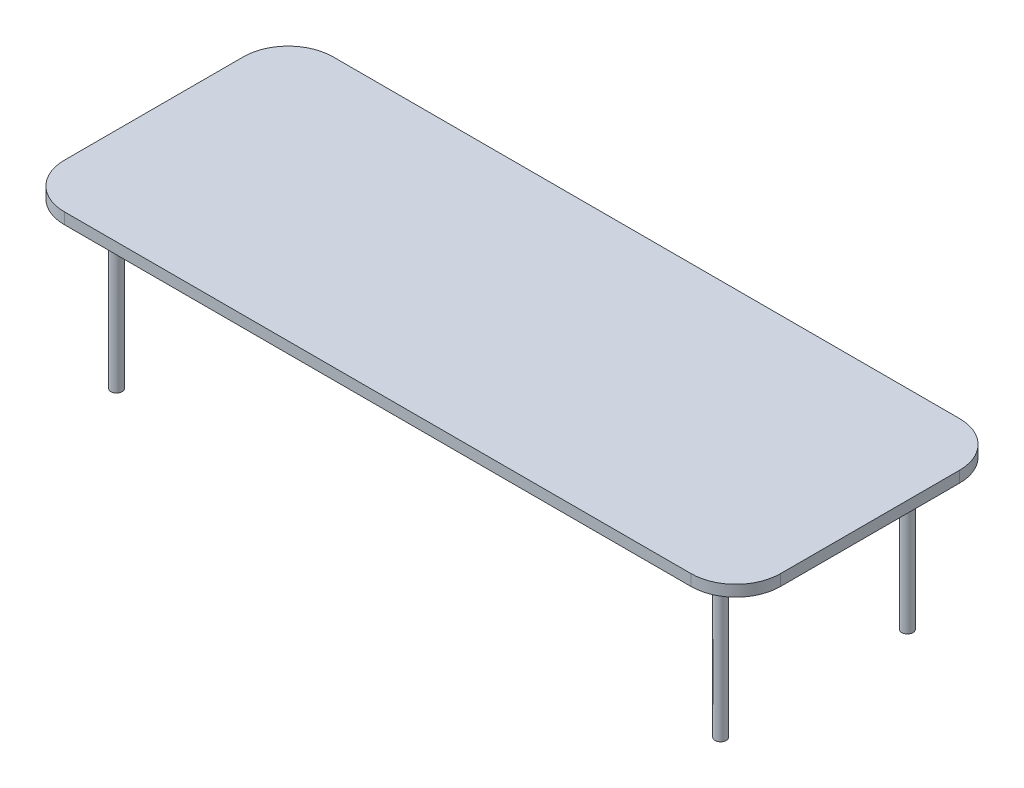
ISO-10303-21;
HEADER;
FILE_DESCRIPTION(('STEP AP214'),'2;1');
FILE_NAME('part.step','',(''),(''),'','','');
FILE_SCHEMA(('AUTOMOTIVE_DESIGN { 1 0 10303 214 1 1 1 1 }'));
ENDSEC;
DATA;
#1=APPLICATION_CONTEXT('core data for automotive mechanical design processes');
#2=APPLICATION_PROTOCOL_DEFINITION('international standard','automotive_design',2000,#1);
#3=PRODUCT_CONTEXT('',#1,'mechanical');
#4=PRODUCT('Part','Part','',(#3));
#5=PRODUCT_RELATED_PRODUCT_CATEGORY('part','',(#4));
#6=PRODUCT_DEFINITION_FORMATION('','',#4);
#7=PRODUCT_DEFINITION_CONTEXT('part definition',#1,'design');
#8=PRODUCT_DEFINITION('design','',#6,#7);
#9=PRODUCT_DEFINITION_SHAPE('','',#8);
#10=(LENGTH_UNIT() NAMED_UNIT(*) SI_UNIT(.MILLI.,.METRE.));
#11=(NAMED_UNIT(*) PLANE_ANGLE_UNIT() SI_UNIT($,.RADIAN.));
#12=(NAMED_UNIT(*) SI_UNIT($,.STERADIAN.) SOLID_ANGLE_UNIT());
#13=UNCERTAINTY_MEASURE_WITH_UNIT(LENGTH_MEASURE(1.E-05),#10,'distance_accuracy_value','');
#14=(GEOMETRIC_REPRESENTATION_CONTEXT(3) GLOBAL_UNCERTAINTY_ASSIGNED_CONTEXT((#13)) GLOBAL_UNIT_ASSIGNED_CONTEXT((#10,
#11,#12)) REPRESENTATION_CONTEXT('',''));
#15=CARTESIAN_POINT('',(0.,0.,0.));
#16=DIRECTION('',(0.,0.,1.));
#17=DIRECTION('',(1.,0.,0.));
#18=AXIS2_PLACEMENT_3D('',#15,#16,#17);
#19=CARTESIAN_POINT('',(1422.4,50.8,-406.4));
#20=DIRECTION('',(0.,-1.,0.));
#21=DIRECTION('',(0.,0.,-1.));
#22=AXIS2_PLACEMENT_3D('',#19,#20,#21);
#23=CYLINDRICAL_SURFACE('',#22,203.2);
#24=CARTESIAN_POINT('',(1422.4,0.,-406.4));
#25=DIRECTION('',(0.,1.,0.));
#26=DIRECTION('',(0.,0.,1.));
#27=AXIS2_PLACEMENT_3D('',#24,#25,#26);
#28=CIRCLE('',#27,203.2);
#29=CARTESIAN_POINT('',(1625.6,0.,-406.399999999999));
#30=VERTEX_POINT('',#29);
#31=CARTESIAN_POINT('',(1422.4,0.,-609.6));
#32=VERTEX_POINT('',#31);
#33=EDGE_CURVE('E132',#30,#32,#28,.T.);
#34=ORIENTED_EDGE('',*,*,#33,.T.);
#35=DIRECTION('',(0.,-1.,0.));
#36=VECTOR('',#35,1.);
#37=CARTESIAN_POINT('',(1422.4,50.8,-609.6));
#38=LINE('',#37,#36);
#39=CARTESIAN_POINT('',(1422.4,50.8,-609.6));
#40=VERTEX_POINT('',#39);
#41=EDGE_CURVE('E160',#40,#32,#38,.T.);
#42=ORIENTED_EDGE('',*,*,#41,.F.);
#43=CARTESIAN_POINT('',(1422.4,50.8,-406.4));
#44=DIRECTION('',(0.,1.,0.));
#45=DIRECTION('',(0.,0.,1.));
#46=AXIS2_PLACEMENT_3D('',#43,#44,#45);
#47=CIRCLE('',#46,203.2);
#48=CARTESIAN_POINT('',(1625.6,50.8,-406.399999999999));
#49=VERTEX_POINT('',#48);
#50=EDGE_CURVE('E147',#49,#40,#47,.T.);
#51=ORIENTED_EDGE('',*,*,#50,.F.);
#52=DIRECTION('',(0.,-1.,0.));
#53=VECTOR('',#52,1.);
#54=CARTESIAN_POINT('',(1625.6,50.8,-406.399999999999));
#55=LINE('',#54,#53);
#56=EDGE_CURVE('E128',#49,#30,#55,.T.);
#57=ORIENTED_EDGE('',*,*,#56,.T.);
#58=EDGE_LOOP('',(#34,#42,#51,#57));
#59=FACE_BOUND('',#58,.T.);
#60=ADVANCED_FACE('F35',(#59),#23,.T.);
#61=CARTESIAN_POINT('',(-1422.4,50.8,-609.6));
#62=DIRECTION('',(0.,0.,1.));
#63=DIRECTION('',(1.,0.,0.));
#64=AXIS2_PLACEMENT_3D('',#61,#62,#63);
#65=PLANE('',#64);
#66=DIRECTION('',(-1.,0.,0.));
#67=VECTOR('',#66,1.);
#68=CARTESIAN_POINT('',(-1422.4,0.,-609.6));
#69=LINE('',#68,#67);
#70=CARTESIAN_POINT('',(-1422.4,0.,-609.6));
#71=VERTEX_POINT('',#70);
#72=EDGE_CURVE('E135',#32,#71,#69,.T.);
#73=ORIENTED_EDGE('',*,*,#72,.T.);
#74=DIRECTION('',(0.,-1.,0.));
#75=VECTOR('',#74,1.);
#76=CARTESIAN_POINT('',(-1422.4,50.8,-609.6));
#77=LINE('',#76,#75);
#78=CARTESIAN_POINT('',(-1422.4,50.8,-609.6));
#79=VERTEX_POINT('',#78);
#80=EDGE_CURVE('E157',#79,#71,#77,.T.);
#81=ORIENTED_EDGE('',*,*,#80,.F.);
#82=DIRECTION('',(-1.,0.,0.));
#83=VECTOR('',#82,1.);
#84=CARTESIAN_POINT('',(-1422.4,50.8,-609.6));
#85=LINE('',#84,#83);
#86=EDGE_CURVE('E95',#40,#79,#85,.T.);
#87=ORIENTED_EDGE('',*,*,#86,.F.);
#88=ORIENTED_EDGE('',*,*,#41,.T.);
#89=EDGE_LOOP('',(#73,#81,#87,#88));
#90=FACE_BOUND('',#89,.T.);
#91=ADVANCED_FACE('F197',(#90),#65,.F.);
#92=CARTESIAN_POINT('',(-1422.4,50.8,-406.4));
#93=DIRECTION('',(0.,-1.,0.));
#94=DIRECTION('',(0.,0.,-1.));
#95=AXIS2_PLACEMENT_3D('',#92,#93,#94);
#96=CYLINDRICAL_SURFACE('',#95,203.2);
#97=CARTESIAN_POINT('',(-1422.4,0.,-406.4));
#98=DIRECTION('',(0.,1.,0.));
#99=DIRECTION('',(0.,0.,1.));
#100=AXIS2_PLACEMENT_3D('',#97,#98,#99);
#101=CIRCLE('',#100,203.2);
#102=CARTESIAN_POINT('',(-1625.6,0.,-406.399999999999));
#103=VERTEX_POINT('',#102);
#104=EDGE_CURVE('E138',#71,#103,#101,.T.);
#105=ORIENTED_EDGE('',*,*,#104,.T.);
#106=DIRECTION('',(0.,-1.,0.));
#107=VECTOR('',#106,1.);
#108=CARTESIAN_POINT('',(-1625.6,50.8,-406.399999999999));
#109=LINE('',#108,#107);
#110=CARTESIAN_POINT('',(-1625.6,50.8,-406.399999999999));
#111=VERTEX_POINT('',#110);
#112=EDGE_CURVE('E154',#111,#103,#109,.T.);
#113=ORIENTED_EDGE('',*,*,#112,.F.);
#114=CARTESIAN_POINT('',(-1422.4,50.8,-406.4));
#115=DIRECTION('',(0.,1.,0.));
#116=DIRECTION('',(0.,0.,1.));
#117=AXIS2_PLACEMENT_3D('',#114,#115,#116);
#118=CIRCLE('',#117,203.2);
#119=EDGE_CURVE('E338',#79,#111,#118,.T.);
#120=ORIENTED_EDGE('',*,*,#119,.F.);
#121=ORIENTED_EDGE('',*,*,#80,.T.);
#122=EDGE_LOOP('',(#105,#113,#120,#121));
#123=FACE_BOUND('',#122,.T.);
#124=ADVANCED_FACE('F201',(#123),#96,.T.);
#125=CARTESIAN_POINT('',(-1625.6,50.8,-406.399999999999));
#126=DIRECTION('',(1.,0.,0.));
#127=DIRECTION('',(0.,0.,-1.));
#128=AXIS2_PLACEMENT_3D('',#125,#126,#127);
#129=PLANE('',#128);
#130=DIRECTION('',(0.,0.,1.));
#131=VECTOR('',#130,1.);
#132=CARTESIAN_POINT('',(-1625.6,0.,-406.399999999999));
#133=LINE('',#132,#131);
#134=CARTESIAN_POINT('',(-1625.6,0.,406.399999999999));
#135=VERTEX_POINT('',#134);
#136=EDGE_CURVE('E140',#103,#135,#133,.T.);
#137=ORIENTED_EDGE('',*,*,#136,.T.);
#138=DIRECTION('',(0.,-1.,0.));
#139=VECTOR('',#138,1.);
#140=CARTESIAN_POINT('',(-1625.6,50.8,406.399999999999));
#141=LINE('',#140,#139);
#142=CARTESIAN_POINT('',(-1625.6,50.8,406.399999999999));
#143=VERTEX_POINT('',#142);
#144=EDGE_CURVE('E151',#143,#135,#141,.T.);
#145=ORIENTED_EDGE('',*,*,#144,.F.);
#146=DIRECTION('',(0.,0.,1.));
#147=VECTOR('',#146,1.);
#148=CARTESIAN_POINT('',(-1625.6,50.8,-406.399999999999));
#149=LINE('',#148,#147);
#150=EDGE_CURVE('E340',#111,#143,#149,.T.);
#151=ORIENTED_EDGE('',*,*,#150,.F.);
#152=ORIENTED_EDGE('',*,*,#112,.T.);
#153=EDGE_LOOP('',(#137,#145,#151,#152));
#154=FACE_BOUND('',#153,.T.);
#155=ADVANCED_FACE('F205',(#154),#129,.F.);
#156=CARTESIAN_POINT('',(-1422.4,50.8,406.4));
#157=DIRECTION('',(0.,-1.,0.));
#158=DIRECTION('',(0.,0.,-1.));
#159=AXIS2_PLACEMENT_3D('',#156,#157,#158);
#160=CYLINDRICAL_SURFACE('',#159,203.2);
#161=CARTESIAN_POINT('',(-1422.4,0.,406.4));
#162=DIRECTION('',(0.,1.,0.));
#163=DIRECTION('',(0.,0.,-1.));
#164=AXIS2_PLACEMENT_3D('',#161,#162,#163);
#165=CIRCLE('',#164,203.2);
#166=CARTESIAN_POINT('',(-1422.4,0.,609.6));
#167=VERTEX_POINT('',#166);
#168=EDGE_CURVE('E142',#135,#167,#165,.T.);
#169=ORIENTED_EDGE('',*,*,#168,.T.);
#170=DIRECTION('',(0.,-1.,0.));
#171=VECTOR('',#170,1.);
#172=CARTESIAN_POINT('',(-1422.4,50.8,609.6));
#173=LINE('',#172,#171);
#174=CARTESIAN_POINT('',(-1422.4,50.8,609.6));
#175=VERTEX_POINT('',#174);
#176=EDGE_CURVE('E123',#175,#167,#173,.T.);
#177=ORIENTED_EDGE('',*,*,#176,.F.);
#178=CARTESIAN_POINT('',(-1422.4,50.8,406.4));
#179=DIRECTION('',(0.,1.,0.));
#180=DIRECTION('',(0.,0.,-1.));
#181=AXIS2_PLACEMENT_3D('',#178,#179,#180);
#182=CIRCLE('',#181,203.2);
#183=EDGE_CURVE('E114',#143,#175,#182,.T.);
#184=ORIENTED_EDGE('',*,*,#183,.F.);
#185=ORIENTED_EDGE('',*,*,#144,.T.);
#186=EDGE_LOOP('',(#169,#177,#184,#185));
#187=FACE_BOUND('',#186,.T.);
#188=ADVANCED_FACE('F211',(#187),#160,.T.);
#189=CARTESIAN_POINT('',(-1422.4,50.8,609.6));
#190=DIRECTION('',(0.,0.,-1.));
#191=DIRECTION('',(-1.,0.,0.));
#192=AXIS2_PLACEMENT_3D('',#189,#190,#191);
#193=PLANE('',#192);
#194=DIRECTION('',(1.,0.,0.));
#195=VECTOR('',#194,1.);
#196=CARTESIAN_POINT('',(-1422.4,0.,609.6));
#197=LINE('',#196,#195);
#198=CARTESIAN_POINT('',(1422.4,0.,609.6));
#199=VERTEX_POINT('',#198);
#200=EDGE_CURVE('E122',#167,#199,#197,.T.);
#201=ORIENTED_EDGE('',*,*,#200,.T.);
#202=DIRECTION('',(0.,-1.,0.));
#203=VECTOR('',#202,1.);
#204=CARTESIAN_POINT('',(1422.4,50.8,609.6));
#205=LINE('',#204,#203);
#206=CARTESIAN_POINT('',(1422.4,50.8,609.6));
#207=VERTEX_POINT('',#206);
#208=EDGE_CURVE('E119',#207,#199,#205,.T.);
#209=ORIENTED_EDGE('',*,*,#208,.F.);
#210=DIRECTION('',(1.,0.,0.));
#211=VECTOR('',#210,1.);
#212=CARTESIAN_POINT('',(-1422.4,50.8,609.6));
#213=LINE('',#212,#211);
#214=EDGE_CURVE('E108',#175,#207,#213,.T.);
#215=ORIENTED_EDGE('',*,*,#214,.F.);
#216=ORIENTED_EDGE('',*,*,#176,.T.);
#217=EDGE_LOOP('',(#201,#209,#215,#216));
#218=FACE_BOUND('',#217,.T.);
#219=ADVANCED_FACE('F120',(#218),#193,.F.);
#220=CARTESIAN_POINT('',(1422.4,50.8,406.4));
#221=DIRECTION('',(0.,-1.,0.));
#222=DIRECTION('',(0.,0.,-1.));
#223=AXIS2_PLACEMENT_3D('',#220,#221,#222);
#224=CYLINDRICAL_SURFACE('',#223,203.2);
#225=CARTESIAN_POINT('',(1422.4,0.,406.4));
#226=DIRECTION('',(0.,1.,0.));
#227=DIRECTION('',(0.,0.,-1.));
#228=AXIS2_PLACEMENT_3D('',#225,#226,#227);
#229=CIRCLE('',#228,203.2);
#230=CARTESIAN_POINT('',(1625.6,0.,406.399999999999));
#231=VERTEX_POINT('',#230);
#232=EDGE_CURVE('E80',#199,#231,#229,.T.);
#233=ORIENTED_EDGE('',*,*,#232,.T.);
#234=DIRECTION('',(0.,-1.,0.));
#235=VECTOR('',#234,1.);
#236=CARTESIAN_POINT('',(1625.6,50.8,406.399999999999));
#237=LINE('',#236,#235);
#238=CARTESIAN_POINT('',(1625.6,50.8,406.399999999999));
#239=VERTEX_POINT('',#238);
#240=EDGE_CURVE('E124',#239,#231,#237,.T.);
#241=ORIENTED_EDGE('',*,*,#240,.F.);
#242=CARTESIAN_POINT('',(1422.4,50.8,406.4));
#243=DIRECTION('',(0.,1.,0.));
#244=DIRECTION('',(0.,0.,-1.));
#245=AXIS2_PLACEMENT_3D('',#242,#243,#244);
#246=CIRCLE('',#245,203.2);
#247=EDGE_CURVE('E112',#207,#239,#246,.T.);
#248=ORIENTED_EDGE('',*,*,#247,.F.);
#249=ORIENTED_EDGE('',*,*,#208,.T.);
#250=EDGE_LOOP('',(#233,#241,#248,#249));
#251=FACE_BOUND('',#250,.T.);
#252=ADVANCED_FACE('F126',(#251),#224,.T.);
#253=CARTESIAN_POINT('',(1625.6,50.8,-406.399999999999));
#254=DIRECTION('',(-1.,0.,0.));
#255=DIRECTION('',(0.,0.,1.));
#256=AXIS2_PLACEMENT_3D('',#253,#254,#255);
#257=PLANE('',#256);
#258=DIRECTION('',(0.,0.,-1.));
#259=VECTOR('',#258,1.);
#260=CARTESIAN_POINT('',(1625.6,0.,-406.399999999999));
#261=LINE('',#260,#259);
#262=EDGE_CURVE('E86',#231,#30,#261,.T.);
#263=ORIENTED_EDGE('',*,*,#262,.T.);
#264=ORIENTED_EDGE('',*,*,#56,.F.);
#265=DIRECTION('',(0.,0.,-1.));
#266=VECTOR('',#265,1.);
#267=CARTESIAN_POINT('',(1625.6,50.8,-406.399999999999));
#268=LINE('',#267,#266);
#269=EDGE_CURVE('E51',#239,#49,#268,.T.);
#270=ORIENTED_EDGE('',*,*,#269,.F.);
#271=ORIENTED_EDGE('',*,*,#240,.T.);
#272=EDGE_LOOP('',(#263,#264,#270,#271));
#273=FACE_BOUND('',#272,.T.);
#274=ADVANCED_FACE('F187',(#273),#257,.F.);
#275=CARTESIAN_POINT('',(1422.4,50.8,-406.4));
#276=DIRECTION('',(0.,1.,0.));
#277=DIRECTION('',(0.,0.,1.));
#278=AXIS2_PLACEMENT_3D('',#275,#276,#277);
#279=PLANE('',#278);
#280=ORIENTED_EDGE('',*,*,#50,.T.);
#281=ORIENTED_EDGE('',*,*,#86,.T.);
#282=ORIENTED_EDGE('',*,*,#119,.T.);
#283=ORIENTED_EDGE('',*,*,#150,.T.);
#284=ORIENTED_EDGE('',*,*,#183,.T.);
#285=ORIENTED_EDGE('',*,*,#214,.T.);
#286=ORIENTED_EDGE('',*,*,#247,.T.);
#287=ORIENTED_EDGE('',*,*,#269,.T.);
#288=EDGE_LOOP('',(#280,#281,#282,#283,#284,#285,#286,#287));
#289=FACE_BOUND('',#288,.T.);
#290=ADVANCED_FACE('F110',(#289),#279,.T.);
#291=CARTESIAN_POINT('',(1422.4,0.,-406.4));
#292=DIRECTION('',(0.,1.,0.));
#293=DIRECTION('',(0.,0.,1.));
#294=AXIS2_PLACEMENT_3D('',#291,#292,#293);
#295=PLANE('',#294);
#296=CARTESIAN_POINT('',(1371.24448168706,0.,424.064320521733));
#297=DIRECTION('',(0.,1.,0.));
#298=DIRECTION('',(0.,0.,1.));
#299=AXIS2_PLACEMENT_3D('',#296,#297,#298);
#300=CIRCLE('',#299,25.4);
#301=CARTESIAN_POINT('',(1371.24448168706,0.,449.464320521733));
#302=VERTEX_POINT('',#301);
#303=EDGE_CURVE('E11',#302,#302,#300,.F.);
#304=ORIENTED_EDGE('',*,*,#303,.F.);
#305=EDGE_LOOP('',(#304));
#306=FACE_BOUND('',#305,.T.);
#307=CARTESIAN_POINT('',(1371.24448168706,0.,-424.064320521733));
#308=DIRECTION('',(0.,1.,0.));
#309=DIRECTION('',(0.,0.,1.));
#310=AXIS2_PLACEMENT_3D('',#307,#308,#309);
#311=CIRCLE('',#310,25.4);
#312=CARTESIAN_POINT('',(1371.24448168706,0.,-398.664320521733));
#313=VERTEX_POINT('',#312);
#314=EDGE_CURVE('E43',#313,#313,#311,.F.);
#315=ORIENTED_EDGE('',*,*,#314,.F.);
#316=EDGE_LOOP('',(#315));
#317=FACE_BOUND('',#316,.T.);
#318=CARTESIAN_POINT('',(-1371.24448168706,0.,-424.064320521733));
#319=DIRECTION('',(0.,1.,0.));
#320=DIRECTION('',(0.,0.,1.));
#321=AXIS2_PLACEMENT_3D('',#318,#319,#320);
#322=CIRCLE('',#321,25.4);
#323=CARTESIAN_POINT('',(-1371.24448168706,0.,-398.664320521733));
#324=VERTEX_POINT('',#323);
#325=EDGE_CURVE('E165',#324,#324,#322,.F.);
#326=ORIENTED_EDGE('',*,*,#325,.F.);
#327=EDGE_LOOP('',(#326));
#328=FACE_BOUND('',#327,.T.);
#329=CARTESIAN_POINT('',(-1371.24448168706,0.,424.064320521733));
#330=DIRECTION('',(0.,1.,0.));
#331=DIRECTION('',(0.,0.,1.));
#332=AXIS2_PLACEMENT_3D('',#329,#330,#331);
#333=CIRCLE('',#332,25.4);
#334=CARTESIAN_POINT('',(-1371.24448168706,0.,449.464320521733));
#335=VERTEX_POINT('',#334);
#336=EDGE_CURVE('E162',#335,#335,#333,.F.);
#337=ORIENTED_EDGE('',*,*,#336,.F.);
#338=EDGE_LOOP('',(#337));
#339=FACE_BOUND('',#338,.T.);
#340=ORIENTED_EDGE('',*,*,#33,.F.);
#341=ORIENTED_EDGE('',*,*,#262,.F.);
#342=ORIENTED_EDGE('',*,*,#232,.F.);
#343=ORIENTED_EDGE('',*,*,#200,.F.);
#344=ORIENTED_EDGE('',*,*,#168,.F.);
#345=ORIENTED_EDGE('',*,*,#136,.F.);
#346=ORIENTED_EDGE('',*,*,#104,.F.);
#347=ORIENTED_EDGE('',*,*,#72,.F.);
#348=EDGE_LOOP('',(#340,#341,#342,#343,#344,#345,#346,#347));
#349=FACE_BOUND('',#348,.T.);
#350=ADVANCED_FACE('F172',(#306,#317,#328,#339,#349),#295,.F.);
#351=CARTESIAN_POINT('',(-1371.24448168706,-711.2,424.064320521733));
#352=DIRECTION('',(0.,1.,0.));
#353=DIRECTION('',(0.,0.,1.));
#354=AXIS2_PLACEMENT_3D('',#351,#352,#353);
#355=CYLINDRICAL_SURFACE('',#354,25.4);
#356=CARTESIAN_POINT('',(-1371.24448168706,-711.2,424.064320521733));
#357=DIRECTION('',(0.,-1.,0.));
#358=DIRECTION('',(0.,0.,-1.));
#359=AXIS2_PLACEMENT_3D('',#356,#357,#358);
#360=CIRCLE('',#359,25.4);
#361=CARTESIAN_POINT('',(-1371.24448168706,-711.2,398.664320521733));
#362=VERTEX_POINT('',#361);
#363=EDGE_CURVE('E136',#362,#362,#360,.T.);
#364=ORIENTED_EDGE('',*,*,#363,.F.);
#365=EDGE_LOOP('',(#364));
#366=FACE_BOUND('',#365,.T.);
#367=ORIENTED_EDGE('',*,*,#336,.T.);
#368=EDGE_LOOP('',(#367));
#369=FACE_BOUND('',#368,.T.);
#370=ADVANCED_FACE('F175',(#366,#369),#355,.T.);
#371=CARTESIAN_POINT('',(-1371.24448168706,-711.2,424.064320521733));
#372=DIRECTION('',(0.,-1.,0.));
#373=DIRECTION('',(0.,0.,-1.));
#374=AXIS2_PLACEMENT_3D('',#371,#372,#373);
#375=PLANE('',#374);
#376=ORIENTED_EDGE('',*,*,#363,.T.);
#377=EDGE_LOOP('',(#376));
#378=FACE_BOUND('',#377,.T.);
#379=ADVANCED_FACE('F250',(#378),#375,.T.);
#380=CARTESIAN_POINT('',(-1371.24448168706,-711.2,-424.064320521733));
#381=DIRECTION('',(0.,1.,0.));
#382=DIRECTION('',(0.,0.,1.));
#383=AXIS2_PLACEMENT_3D('',#380,#381,#382);
#384=CYLINDRICAL_SURFACE('',#383,25.4);
#385=CARTESIAN_POINT('',(-1371.24448168706,-711.2,-424.064320521733));
#386=DIRECTION('',(0.,-1.,0.));
#387=DIRECTION('',(0.,0.,-1.));
#388=AXIS2_PLACEMENT_3D('',#385,#386,#387);
#389=CIRCLE('',#388,25.4);
#390=CARTESIAN_POINT('',(-1371.24448168706,-711.2,-449.464320521733));
#391=VERTEX_POINT('',#390);
#392=EDGE_CURVE('E329',#391,#391,#389,.T.);
#393=ORIENTED_EDGE('',*,*,#392,.F.);
#394=EDGE_LOOP('',(#393));
#395=FACE_BOUND('',#394,.T.);
#396=ORIENTED_EDGE('',*,*,#325,.T.);
#397=EDGE_LOOP('',(#396));
#398=FACE_BOUND('',#397,.T.);
#399=ADVANCED_FACE('F260',(#395,#398),#384,.T.);
#400=CARTESIAN_POINT('',(-1371.24448168706,-711.2,-424.064320521733));
#401=DIRECTION('',(0.,-1.,0.));
#402=DIRECTION('',(0.,0.,-1.));
#403=AXIS2_PLACEMENT_3D('',#400,#401,#402);
#404=PLANE('',#403);
#405=ORIENTED_EDGE('',*,*,#392,.T.);
#406=EDGE_LOOP('',(#405));
#407=FACE_BOUND('',#406,.T.);
#408=ADVANCED_FACE('F270',(#407),#404,.T.);
#409=CARTESIAN_POINT('',(1371.24448168706,-711.2,-424.064320521733));
#410=DIRECTION('',(0.,1.,0.));
#411=DIRECTION('',(0.,0.,1.));
#412=AXIS2_PLACEMENT_3D('',#409,#410,#411);
#413=CYLINDRICAL_SURFACE('',#412,25.4);
#414=CARTESIAN_POINT('',(1371.24448168706,-711.2,-424.064320521733));
#415=DIRECTION('',(0.,-1.,0.));
#416=DIRECTION('',(0.,0.,-1.));
#417=AXIS2_PLACEMENT_3D('',#414,#415,#416);
#418=CIRCLE('',#417,25.4);
#419=CARTESIAN_POINT('',(1371.24448168706,-711.2,-449.464320521733));
#420=VERTEX_POINT('',#419);
#421=EDGE_CURVE('E326',#420,#420,#418,.T.);
#422=ORIENTED_EDGE('',*,*,#421,.F.);
#423=EDGE_LOOP('',(#422));
#424=FACE_BOUND('',#423,.T.);
#425=ORIENTED_EDGE('',*,*,#314,.T.);
#426=EDGE_LOOP('',(#425));
#427=FACE_BOUND('',#426,.T.);
#428=ADVANCED_FACE('F170',(#424,#427),#413,.T.);
#429=CARTESIAN_POINT('',(1371.24448168706,-711.2,-424.064320521733));
#430=DIRECTION('',(0.,-1.,0.));
#431=DIRECTION('',(0.,0.,-1.));
#432=AXIS2_PLACEMENT_3D('',#429,#430,#431);
#433=PLANE('',#432);
#434=ORIENTED_EDGE('',*,*,#421,.T.);
#435=EDGE_LOOP('',(#434));
#436=FACE_BOUND('',#435,.T.);
#437=ADVANCED_FACE('F289',(#436),#433,.T.);
#438=CARTESIAN_POINT('',(1371.24448168706,-711.2,424.064320521733));
#439=DIRECTION('',(0.,1.,0.));
#440=DIRECTION('',(0.,0.,1.));
#441=AXIS2_PLACEMENT_3D('',#438,#439,#440);
#442=CYLINDRICAL_SURFACE('',#441,25.4);
#443=CARTESIAN_POINT('',(1371.24448168706,-711.2,424.064320521733));
#444=DIRECTION('',(0.,-1.,0.));
#445=DIRECTION('',(0.,0.,-1.));
#446=AXIS2_PLACEMENT_3D('',#443,#444,#445);
#447=CIRCLE('',#446,25.4);
#448=CARTESIAN_POINT('',(1371.24448168706,-711.2,398.664320521733));
#449=VERTEX_POINT('',#448);
#450=EDGE_CURVE('E325',#449,#449,#447,.T.);
#451=ORIENTED_EDGE('',*,*,#450,.F.);
#452=EDGE_LOOP('',(#451));
#453=FACE_BOUND('',#452,.T.);
#454=ORIENTED_EDGE('',*,*,#303,.T.);
#455=EDGE_LOOP('',(#454));
#456=FACE_BOUND('',#455,.T.);
#457=ADVANCED_FACE('F299',(#453,#456),#442,.T.);
#458=CARTESIAN_POINT('',(1371.24448168706,-711.2,424.064320521733));
#459=DIRECTION('',(0.,-1.,0.));
#460=DIRECTION('',(0.,0.,-1.));
#461=AXIS2_PLACEMENT_3D('',#458,#459,#460);
#462=PLANE('',#461);
#463=ORIENTED_EDGE('',*,*,#450,.T.);
#464=EDGE_LOOP('',(#463));
#465=FACE_BOUND('',#464,.T.);
#466=ADVANCED_FACE('F309',(#465),#462,.T.);
#467=CLOSED_SHELL('',(#60,#91,#124,#155,#188,#219,#252,#274,#290,#350,#370,#379,#399,#408,#428,
#437,#457,#466));
#468=MANIFOLD_SOLID_BREP('B2',#467);
#469=ADVANCED_BREP_SHAPE_REPRESENTATION('',(#18,#468),#14);
#470=SHAPE_DEFINITION_REPRESENTATION(#9,#469);
ENDSEC;
END-ISO-10303-21;
